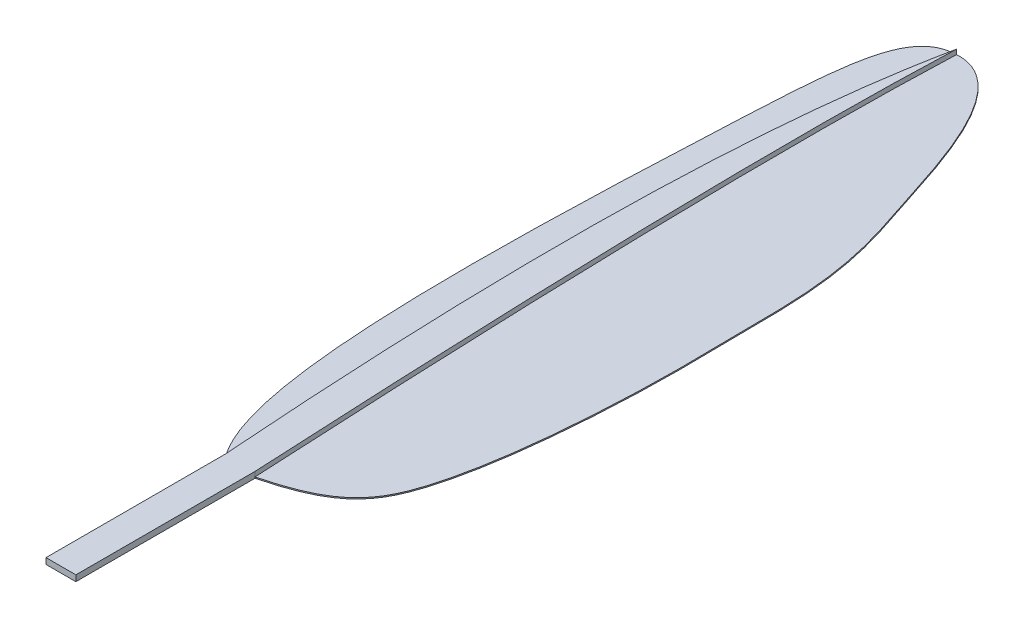
ISO-10303-21;
HEADER;
FILE_DESCRIPTION(('STEP AP214'),'2;1');
FILE_NAME('part.step','',(''),(''),'','','');
FILE_SCHEMA(('AUTOMOTIVE_DESIGN { 1 0 10303 214 1 1 1 1 }'));
ENDSEC;
DATA;
#1=APPLICATION_CONTEXT('core data for automotive mechanical design processes');
#2=APPLICATION_PROTOCOL_DEFINITION('international standard','automotive_design',2000,#1);
#3=PRODUCT_CONTEXT('',#1,'mechanical');
#4=PRODUCT('Part','Part','',(#3));
#5=PRODUCT_RELATED_PRODUCT_CATEGORY('part','',(#4));
#6=PRODUCT_DEFINITION_FORMATION('','',#4);
#7=PRODUCT_DEFINITION_CONTEXT('part definition',#1,'design');
#8=PRODUCT_DEFINITION('design','',#6,#7);
#9=PRODUCT_DEFINITION_SHAPE('','',#8);
#10=(LENGTH_UNIT() NAMED_UNIT(*) SI_UNIT(.MILLI.,.METRE.));
#11=(NAMED_UNIT(*) PLANE_ANGLE_UNIT() SI_UNIT($,.RADIAN.));
#12=(NAMED_UNIT(*) SI_UNIT($,.STERADIAN.) SOLID_ANGLE_UNIT());
#13=UNCERTAINTY_MEASURE_WITH_UNIT(LENGTH_MEASURE(1.E-05),#10,'distance_accuracy_value','');
#14=(GEOMETRIC_REPRESENTATION_CONTEXT(3) GLOBAL_UNCERTAINTY_ASSIGNED_CONTEXT((#13)) GLOBAL_UNIT_ASSIGNED_CONTEXT((#10,
#11,#12)) REPRESENTATION_CONTEXT('',''));
#15=CARTESIAN_POINT('',(0.,0.,0.));
#16=DIRECTION('',(0.,0.,1.));
#17=DIRECTION('',(1.,0.,0.));
#18=AXIS2_PLACEMENT_3D('',#15,#16,#17);
#19=CARTESIAN_POINT('',(-2.5,1.,0.));
#20=CARTESIAN_POINT('',(-8.33151031217227,1.,-79.885222780422));
#21=CARTESIAN_POINT('',(0.,1.,-120.));
#22=B_SPLINE_CURVE_WITH_KNOTS('',2,(#19,#20,#21),.UNSPECIFIED.,.F.,.F.,(3,3),(0.,1.),.UNSPECIFIED.);
#23=DIRECTION('',(0.,-1.,0.));
#24=VECTOR('',#23,1.);
#25=SURFACE_OF_LINEAR_EXTRUSION('',#22,#24);
#26=CARTESIAN_POINT('',(-2.5,0.2,0.));
#27=CARTESIAN_POINT('',(-8.33151031217227,0.2,-79.885222780422));
#28=CARTESIAN_POINT('',(0.,0.2,-120.));
#29=B_SPLINE_CURVE_WITH_KNOTS('',2,(#26,#27,#28),.UNSPECIFIED.,.F.,.F.,(3,3),(0.,1.),.UNSPECIFIED.);
#30=CARTESIAN_POINT('',(-2.5,0.2,0.));
#31=VERTEX_POINT('',#30);
#32=CARTESIAN_POINT('',(0.,0.2,-120.));
#33=VERTEX_POINT('',#32);
#34=EDGE_CURVE('E97',#31,#33,#29,.T.);
#35=ORIENTED_EDGE('',*,*,#34,.F.);
#36=DIRECTION('',(0.,-1.,0.));
#37=VECTOR('',#36,1.);
#38=CARTESIAN_POINT('',(-2.5,1.,0.));
#39=LINE('',#38,#37);
#40=CARTESIAN_POINT('',(-2.5,1.,0.));
#41=VERTEX_POINT('',#40);
#42=EDGE_CURVE('E12',#41,#31,#39,.T.);
#43=ORIENTED_EDGE('',*,*,#42,.F.);
#44=CARTESIAN_POINT('',(0.,1.,-120.));
#45=VERTEX_POINT('',#44);
#46=EDGE_CURVE('E263',#41,#45,#22,.T.);
#47=ORIENTED_EDGE('',*,*,#46,.T.);
#48=DIRECTION('',(0.,-1.,0.));
#49=VECTOR('',#48,1.);
#50=CARTESIAN_POINT('',(0.,1.,-120.));
#51=LINE('',#50,#49);
#52=EDGE_CURVE('E187',#45,#33,#51,.T.);
#53=ORIENTED_EDGE('',*,*,#52,.T.);
#54=EDGE_LOOP('',(#35,#43,#47,#53));
#55=FACE_BOUND('',#54,.T.);
#56=ADVANCED_FACE('F79',(#55),#25,.T.);
#57=CARTESIAN_POINT('',(-2.5,1.,0.));
#58=DIRECTION('',(1.,0.,0.));
#59=DIRECTION('',(0.,0.,-1.));
#60=AXIS2_PLACEMENT_3D('',#57,#58,#59);
#61=PLANE('',#60);
#62=DIRECTION('',(0.,0.,1.));
#63=VECTOR('',#62,1.);
#64=CARTESIAN_POINT('',(-2.5,0.,0.));
#65=LINE('',#64,#63);
#66=CARTESIAN_POINT('',(-2.5,0.,0.));
#67=VERTEX_POINT('',#66);
#68=CARTESIAN_POINT('',(-2.5,0.,30.));
#69=VERTEX_POINT('',#68);
#70=EDGE_CURVE('E156',#67,#69,#65,.T.);
#71=ORIENTED_EDGE('',*,*,#70,.T.);
#72=DIRECTION('',(0.,-1.,0.));
#73=VECTOR('',#72,1.);
#74=CARTESIAN_POINT('',(-2.5,1.,30.));
#75=LINE('',#74,#73);
#76=CARTESIAN_POINT('',(-2.5,1.,30.));
#77=VERTEX_POINT('',#76);
#78=EDGE_CURVE('E89',#77,#69,#75,.T.);
#79=ORIENTED_EDGE('',*,*,#78,.F.);
#80=DIRECTION('',(0.,0.,1.));
#81=VECTOR('',#80,1.);
#82=CARTESIAN_POINT('',(-2.5,1.,0.));
#83=LINE('',#82,#81);
#84=EDGE_CURVE('E266',#41,#77,#83,.T.);
#85=ORIENTED_EDGE('',*,*,#84,.F.);
#86=ORIENTED_EDGE('',*,*,#42,.T.);
#87=DIRECTION('',(0.,-1.,0.));
#88=VECTOR('',#87,1.);
#89=CARTESIAN_POINT('',(-2.5,0.2,0.));
#90=LINE('',#89,#88);
#91=EDGE_CURVE('E160',#31,#67,#90,.T.);
#92=ORIENTED_EDGE('',*,*,#91,.T.);
#93=EDGE_LOOP('',(#71,#79,#85,#86,#92));
#94=FACE_BOUND('',#93,.T.);
#95=ADVANCED_FACE('F281',(#94),#61,.F.);
#96=CARTESIAN_POINT('',(0.,1.,30.));
#97=DIRECTION('',(0.,0.,-1.));
#98=DIRECTION('',(-1.,0.,0.));
#99=AXIS2_PLACEMENT_3D('',#96,#97,#98);
#100=PLANE('',#99);
#101=DIRECTION('',(1.,0.,0.));
#102=VECTOR('',#101,1.);
#103=CARTESIAN_POINT('',(0.,0.,30.));
#104=LINE('',#103,#102);
#105=CARTESIAN_POINT('',(2.5,0.,30.));
#106=VERTEX_POINT('',#105);
#107=EDGE_CURVE('E259',#69,#106,#104,.T.);
#108=ORIENTED_EDGE('',*,*,#107,.T.);
#109=DIRECTION('',(0.,-1.,0.));
#110=VECTOR('',#109,1.);
#111=CARTESIAN_POINT('',(2.5,1.,30.));
#112=LINE('',#111,#110);
#113=CARTESIAN_POINT('',(2.5,1.,30.));
#114=VERTEX_POINT('',#113);
#115=EDGE_CURVE('E199',#114,#106,#112,.T.);
#116=ORIENTED_EDGE('',*,*,#115,.F.);
#117=DIRECTION('',(1.,0.,0.));
#118=VECTOR('',#117,1.);
#119=CARTESIAN_POINT('',(0.,1.,30.));
#120=LINE('',#119,#118);
#121=EDGE_CURVE('E269',#77,#114,#120,.T.);
#122=ORIENTED_EDGE('',*,*,#121,.F.);
#123=ORIENTED_EDGE('',*,*,#78,.T.);
#124=EDGE_LOOP('',(#108,#116,#122,#123));
#125=FACE_BOUND('',#124,.T.);
#126=ADVANCED_FACE('F285',(#125),#100,.F.);
#127=CARTESIAN_POINT('',(2.5,1.,0.));
#128=DIRECTION('',(1.,0.,0.));
#129=DIRECTION('',(0.,0.,-1.));
#130=AXIS2_PLACEMENT_3D('',#127,#128,#129);
#131=PLANE('',#130);
#132=DIRECTION('',(0.,0.,1.));
#133=VECTOR('',#132,1.);
#134=CARTESIAN_POINT('',(2.5,0.,0.));
#135=LINE('',#134,#133);
#136=CARTESIAN_POINT('',(2.5,0.,0.));
#137=VERTEX_POINT('',#136);
#138=EDGE_CURVE('E196',#137,#106,#135,.T.);
#139=ORIENTED_EDGE('',*,*,#138,.F.);
#140=DIRECTION('',(0.,-1.,0.));
#141=VECTOR('',#140,1.);
#142=CARTESIAN_POINT('',(2.5,0.2,0.));
#143=LINE('',#142,#141);
#144=CARTESIAN_POINT('',(2.5,0.2,0.));
#145=VERTEX_POINT('',#144);
#146=EDGE_CURVE('E104',#145,#137,#143,.T.);
#147=ORIENTED_EDGE('',*,*,#146,.F.);
#148=DIRECTION('',(0.,-1.,0.));
#149=VECTOR('',#148,1.);
#150=CARTESIAN_POINT('',(2.5,1.,0.));
#151=LINE('',#150,#149);
#152=CARTESIAN_POINT('',(2.5,1.,0.));
#153=VERTEX_POINT('',#152);
#154=EDGE_CURVE('E191',#153,#145,#151,.T.);
#155=ORIENTED_EDGE('',*,*,#154,.F.);
#156=DIRECTION('',(0.,0.,1.));
#157=VECTOR('',#156,1.);
#158=CARTESIAN_POINT('',(2.5,1.,0.));
#159=LINE('',#158,#157);
#160=EDGE_CURVE('E253',#153,#114,#159,.T.);
#161=ORIENTED_EDGE('',*,*,#160,.T.);
#162=ORIENTED_EDGE('',*,*,#115,.T.);
#163=EDGE_LOOP('',(#139,#147,#155,#161,#162));
#164=FACE_BOUND('',#163,.T.);
#165=ADVANCED_FACE('F245',(#164),#131,.T.);
#166=CARTESIAN_POINT('',(2.5,1.,0.));
#167=CARTESIAN_POINT('',(-1.63918434809833,1.,-79.8301801534041));
#168=CARTESIAN_POINT('',(0.,1.,-120.));
#169=B_SPLINE_CURVE_WITH_KNOTS('',2,(#166,#167,#168),.UNSPECIFIED.,.F.,.F.,(3,3),(0.,1.),.UNSPECIFIED.);
#170=DIRECTION('',(0.,-1.,0.));
#171=VECTOR('',#170,1.);
#172=SURFACE_OF_LINEAR_EXTRUSION('',#169,#171);
#173=ORIENTED_EDGE('',*,*,#154,.T.);
#174=CARTESIAN_POINT('',(2.5,0.2,0.));
#175=CARTESIAN_POINT('',(-1.63918434809833,0.2,-79.8301801534041));
#176=CARTESIAN_POINT('',(0.,0.2,-120.));
#177=B_SPLINE_CURVE_WITH_KNOTS('',2,(#174,#175,#176),.UNSPECIFIED.,.F.,.F.,(3,3),(0.,1.),.UNSPECIFIED.);
#178=EDGE_CURVE('E148',#145,#33,#177,.T.);
#179=ORIENTED_EDGE('',*,*,#178,.T.);
#180=ORIENTED_EDGE('',*,*,#52,.F.);
#181=EDGE_CURVE('E192',#153,#45,#169,.T.);
#182=ORIENTED_EDGE('',*,*,#181,.F.);
#183=EDGE_LOOP('',(#173,#179,#180,#182));
#184=FACE_BOUND('',#183,.T.);
#185=ADVANCED_FACE('F209',(#184),#172,.F.);
#186=CARTESIAN_POINT('',(0.,1.,0.));
#187=DIRECTION('',(0.,1.,0.));
#188=DIRECTION('',(0.,0.,1.));
#189=AXIS2_PLACEMENT_3D('',#186,#187,#188);
#190=PLANE('',#189);
#191=ORIENTED_EDGE('',*,*,#46,.F.);
#192=ORIENTED_EDGE('',*,*,#84,.T.);
#193=ORIENTED_EDGE('',*,*,#121,.T.);
#194=ORIENTED_EDGE('',*,*,#160,.F.);
#195=ORIENTED_EDGE('',*,*,#181,.T.);
#196=EDGE_LOOP('',(#191,#192,#193,#194,#195));
#197=FACE_BOUND('',#196,.T.);
#198=ADVANCED_FACE('F236',(#197),#190,.T.);
#199=CARTESIAN_POINT('',(0.,0.,0.));
#200=DIRECTION('',(0.,1.,0.));
#201=DIRECTION('',(0.,0.,1.));
#202=AXIS2_PLACEMENT_3D('',#199,#200,#201);
#203=PLANE('',#202);
#204=ORIENTED_EDGE('',*,*,#70,.F.);
#205=CARTESIAN_POINT('',(0.,0.,-120.));
#206=CARTESIAN_POINT('',(-7.35753604473763,0.,-119.756200735484));
#207=CARTESIAN_POINT('',(-8.16949870182,0.,-106.932489896478));
#208=CARTESIAN_POINT('',(-11.3784005722819,0.,-37.613830712135));
#209=CARTESIAN_POINT('',(-9.55772822347636,0.,-8.383257229566));
#210=CARTESIAN_POINT('',(-2.49999999999997,0.,0.));
#211=B_SPLINE_CURVE_WITH_KNOTS('',3,(#205,#206,#207,#208,#209,#210),.UNSPECIFIED.,.F.,.F.,(4,1,
1,4),(0.,0.317116431739107,0.417116431739107,1.),.UNSPECIFIED.);
#212=CARTESIAN_POINT('',(0.,0.,-120.));
#213=VERTEX_POINT('',#212);
#214=EDGE_CURVE('E153',#213,#67,#211,.T.);
#215=ORIENTED_EDGE('',*,*,#214,.F.);
#216=CARTESIAN_POINT('',(2.5,0.,0.));
#217=CARTESIAN_POINT('',(12.9304114999269,0.,-2.64792493068522));
#218=CARTESIAN_POINT('',(20.6328019081659,0.,-11.6617459855838));
#219=CARTESIAN_POINT('',(22.5217724682605,0.,-44.6895764891039));
#220=CARTESIAN_POINT('',(22.0540906428514,0.,-66.9531391395728));
#221=CARTESIAN_POINT('',(22.5610445141477,0.,-78.1479087350842));
#222=CARTESIAN_POINT('',(15.3521544776859,0.,-99.0842673679077));
#223=CARTESIAN_POINT('',(8.94241288910098,0.,-120.567138422392));
#224=CARTESIAN_POINT('',(0.,0.,-120.));
#225=B_SPLINE_CURVE_WITH_KNOTS('',3,(#216,#217,#218,#219,#220,#221,#222,#223,#224),
.UNSPECIFIED.,.F.,.F.,(4,1,1,1,1,1,4),(0.,0.156099619785498,0.394681350415879,0.460940872053778,
0.75243531452659,0.809984907852122,1.),.UNSPECIFIED.);
#226=EDGE_CURVE('E138',#137,#213,#225,.T.);
#227=ORIENTED_EDGE('',*,*,#226,.F.);
#228=ORIENTED_EDGE('',*,*,#138,.T.);
#229=ORIENTED_EDGE('',*,*,#107,.F.);
#230=EDGE_LOOP('',(#204,#215,#227,#228,#229));
#231=FACE_BOUND('',#230,.T.);
#232=ADVANCED_FACE('F154',(#231),#203,.F.);
#233=CARTESIAN_POINT('',(2.5,0.2,0.));
#234=CARTESIAN_POINT('',(12.9304114999269,0.2,-2.64792493068522));
#235=CARTESIAN_POINT('',(20.6328019081659,0.2,-11.6617459855838));
#236=CARTESIAN_POINT('',(22.5217724682605,0.2,-44.6895764891039));
#237=CARTESIAN_POINT('',(22.0540906428514,0.2,-66.9531391395728));
#238=CARTESIAN_POINT('',(22.5610445141477,0.2,-78.1479087350842));
#239=CARTESIAN_POINT('',(15.3521544776859,0.2,-99.0842673679077));
#240=CARTESIAN_POINT('',(8.94241288910098,0.2,-120.567138422392));
#241=CARTESIAN_POINT('',(0.,0.2,-120.));
#242=B_SPLINE_CURVE_WITH_KNOTS('',3,(#233,#234,#235,#236,#237,#238,#239,#240,#241),
.UNSPECIFIED.,.F.,.F.,(4,1,1,1,1,1,4),(0.,0.156099619785498,0.394681350415879,0.460940872053778,
0.75243531452659,0.809984907852122,1.),.UNSPECIFIED.);
#243=DIRECTION('',(0.,-1.,0.));
#244=VECTOR('',#243,1.);
#245=SURFACE_OF_LINEAR_EXTRUSION('',#242,#244);
#246=ORIENTED_EDGE('',*,*,#226,.T.);
#247=DIRECTION('',(0.,-1.,0.));
#248=VECTOR('',#247,1.);
#249=CARTESIAN_POINT('',(0.,0.2,-120.));
#250=LINE('',#249,#248);
#251=EDGE_CURVE('E143',#33,#213,#250,.T.);
#252=ORIENTED_EDGE('',*,*,#251,.F.);
#253=EDGE_CURVE('E165',#145,#33,#242,.T.);
#254=ORIENTED_EDGE('',*,*,#253,.F.);
#255=ORIENTED_EDGE('',*,*,#146,.T.);
#256=EDGE_LOOP('',(#246,#252,#254,#255));
#257=FACE_BOUND('',#256,.T.);
#258=ADVANCED_FACE('F140',(#257),#245,.F.);
#259=CARTESIAN_POINT('',(0.,0.2,0.));
#260=DIRECTION('',(0.,1.,0.));
#261=DIRECTION('',(0.,0.,1.));
#262=AXIS2_PLACEMENT_3D('',#259,#260,#261);
#263=PLANE('',#262);
#264=ORIENTED_EDGE('',*,*,#178,.F.);
#265=ORIENTED_EDGE('',*,*,#253,.T.);
#266=EDGE_LOOP('',(#264,#265));
#267=FACE_BOUND('',#266,.T.);
#268=ADVANCED_FACE('F214',(#267),#263,.T.);
#269=CARTESIAN_POINT('',(0.,0.2,-120.));
#270=CARTESIAN_POINT('',(-7.35753604473763,0.2,-119.756200735484));
#271=CARTESIAN_POINT('',(-8.16949870182,0.2,-106.932489896478));
#272=CARTESIAN_POINT('',(-11.3784005722819,0.2,-37.613830712135));
#273=CARTESIAN_POINT('',(-9.55772822347636,0.2,-8.383257229566));
#274=CARTESIAN_POINT('',(-2.49999999999997,0.2,0.));
#275=B_SPLINE_CURVE_WITH_KNOTS('',3,(#269,#270,#271,#272,#273,#274),.UNSPECIFIED.,.F.,.F.,(4,1,
1,4),(0.,0.317116431739107,0.417116431739107,1.),.UNSPECIFIED.);
#276=DIRECTION('',(0.,-1.,0.));
#277=VECTOR('',#276,1.);
#278=SURFACE_OF_LINEAR_EXTRUSION('',#275,#277);
#279=ORIENTED_EDGE('',*,*,#214,.T.);
#280=ORIENTED_EDGE('',*,*,#91,.F.);
#281=EDGE_CURVE('E149',#33,#31,#275,.T.);
#282=ORIENTED_EDGE('',*,*,#281,.F.);
#283=ORIENTED_EDGE('',*,*,#251,.T.);
#284=EDGE_LOOP('',(#279,#280,#282,#283));
#285=FACE_BOUND('',#284,.T.);
#286=ADVANCED_FACE('F162',(#285),#278,.F.);
#287=CARTESIAN_POINT('',(0.,0.2,0.));
#288=DIRECTION('',(0.,1.,0.));
#289=DIRECTION('',(0.,0.,1.));
#290=AXIS2_PLACEMENT_3D('',#287,#288,#289);
#291=PLANE('',#290);
#292=ORIENTED_EDGE('',*,*,#34,.T.);
#293=ORIENTED_EDGE('',*,*,#281,.T.);
#294=EDGE_LOOP('',(#292,#293));
#295=FACE_BOUND('',#294,.T.);
#296=ADVANCED_FACE('F304',(#295),#291,.T.);
#297=CLOSED_SHELL('',(#56,#95,#126,#165,#185,#198,#232,#258,#268,#286,#296));
#298=MANIFOLD_SOLID_BREP('B2',#297);
#299=ADVANCED_BREP_SHAPE_REPRESENTATION('',(#18,#298),#14);
#300=SHAPE_DEFINITION_REPRESENTATION(#9,#299);
ENDSEC;
END-ISO-10303-21;
